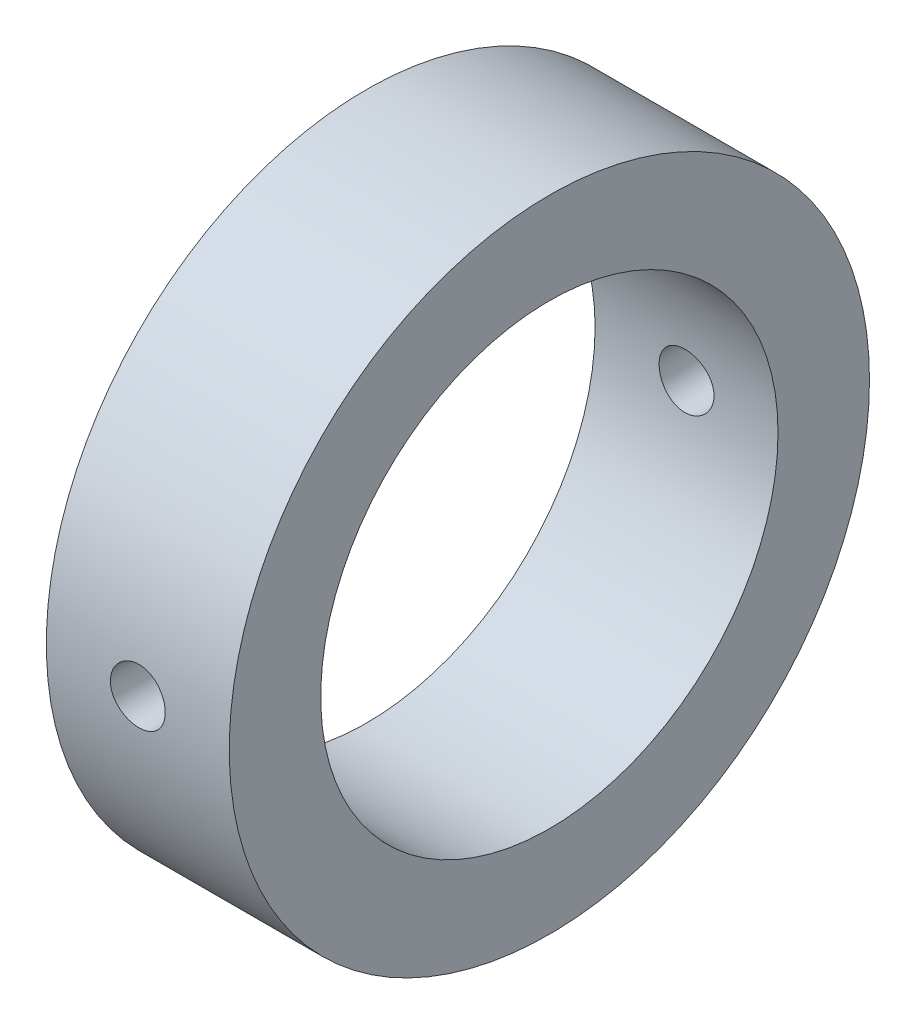
ISO-10303-21;
HEADER;
FILE_DESCRIPTION(('STEP AP214'),'2;1');
FILE_NAME('part.step','',(''),(''),'','','');
FILE_SCHEMA(('AUTOMOTIVE_DESIGN { 1 0 10303 214 1 1 1 1 }'));
ENDSEC;
DATA;
#1=APPLICATION_CONTEXT('core data for automotive mechanical design processes');
#2=APPLICATION_PROTOCOL_DEFINITION('international standard','automotive_design',2000,#1);
#3=PRODUCT_CONTEXT('',#1,'mechanical');
#4=PRODUCT('Part','Part','',(#3));
#5=PRODUCT_RELATED_PRODUCT_CATEGORY('part','',(#4));
#6=PRODUCT_DEFINITION_FORMATION('','',#4);
#7=PRODUCT_DEFINITION_CONTEXT('part definition',#1,'design');
#8=PRODUCT_DEFINITION('design','',#6,#7);
#9=PRODUCT_DEFINITION_SHAPE('','',#8);
#10=(LENGTH_UNIT() NAMED_UNIT(*) SI_UNIT(.MILLI.,.METRE.));
#11=(NAMED_UNIT(*) PLANE_ANGLE_UNIT() SI_UNIT($,.RADIAN.));
#12=(NAMED_UNIT(*) SI_UNIT($,.STERADIAN.) SOLID_ANGLE_UNIT());
#13=UNCERTAINTY_MEASURE_WITH_UNIT(LENGTH_MEASURE(1.E-05),#10,'distance_accuracy_value','');
#14=(GEOMETRIC_REPRESENTATION_CONTEXT(3) GLOBAL_UNCERTAINTY_ASSIGNED_CONTEXT((#13)) GLOBAL_UNIT_ASSIGNED_CONTEXT((#10,
#11,#12)) REPRESENTATION_CONTEXT('',''));
#15=CARTESIAN_POINT('',(0.,0.,0.));
#16=DIRECTION('',(0.,0.,1.));
#17=DIRECTION('',(1.,0.,0.));
#18=AXIS2_PLACEMENT_3D('',#15,#16,#17);
#19=CARTESIAN_POINT('',(20.,0.,0.));
#20=DIRECTION('',(1.,0.,0.));
#21=DIRECTION('',(0.,0.,-1.));
#22=AXIS2_PLACEMENT_3D('',#19,#20,#21);
#23=PLANE('',#22);
#24=CARTESIAN_POINT('',(20.,0.,0.));
#25=DIRECTION('',(1.,0.,0.));
#26=DIRECTION('',(0.,0.,-1.));
#27=AXIS2_PLACEMENT_3D('',#24,#25,#26);
#28=CIRCLE('',#27,35.);
#29=CARTESIAN_POINT('',(20.,0.,-35.));
#30=VERTEX_POINT('',#29);
#31=EDGE_CURVE('E10',#30,#30,#28,.T.);
#32=ORIENTED_EDGE('',*,*,#31,.T.);
#33=EDGE_LOOP('',(#32));
#34=FACE_BOUND('',#33,.T.);
#35=CARTESIAN_POINT('',(20.,0.,0.));
#36=DIRECTION('',(1.,0.,0.));
#37=DIRECTION('',(0.,0.,-1.));
#38=AXIS2_PLACEMENT_3D('',#35,#36,#37);
#39=CIRCLE('',#38,25.);
#40=CARTESIAN_POINT('',(20.,0.,-25.));
#41=VERTEX_POINT('',#40);
#42=EDGE_CURVE('E64',#41,#41,#39,.T.);
#43=ORIENTED_EDGE('',*,*,#42,.F.);
#44=EDGE_LOOP('',(#43));
#45=FACE_BOUND('',#44,.T.);
#46=ADVANCED_FACE('F43',(#34,#45),#23,.T.);
#47=CARTESIAN_POINT('',(0.,0.,0.));
#48=DIRECTION('',(1.,0.,0.));
#49=DIRECTION('',(0.,0.,-1.));
#50=AXIS2_PLACEMENT_3D('',#47,#48,#49);
#51=PLANE('',#50);
#52=CARTESIAN_POINT('',(0.,0.,0.));
#53=DIRECTION('',(1.,0.,0.));
#54=DIRECTION('',(0.,0.,-1.));
#55=AXIS2_PLACEMENT_3D('',#52,#53,#54);
#56=CIRCLE('',#55,35.);
#57=CARTESIAN_POINT('',(0.,0.,-35.));
#58=VERTEX_POINT('',#57);
#59=EDGE_CURVE('E58',#58,#58,#56,.T.);
#60=ORIENTED_EDGE('',*,*,#59,.F.);
#61=EDGE_LOOP('',(#60));
#62=FACE_BOUND('',#61,.T.);
#63=CARTESIAN_POINT('',(0.,0.,0.));
#64=DIRECTION('',(1.,0.,0.));
#65=DIRECTION('',(0.,0.,-1.));
#66=AXIS2_PLACEMENT_3D('',#63,#64,#65);
#67=CIRCLE('',#66,25.);
#68=CARTESIAN_POINT('',(0.,0.,-25.));
#69=VERTEX_POINT('',#68);
#70=EDGE_CURVE('E67',#69,#69,#67,.T.);
#71=ORIENTED_EDGE('',*,*,#70,.T.);
#72=EDGE_LOOP('',(#71));
#73=FACE_BOUND('',#72,.T.);
#74=ADVANCED_FACE('F108',(#62,#73),#51,.F.);
#75=CARTESIAN_POINT('',(20.,0.,0.));
#76=DIRECTION('',(-1.,0.,0.));
#77=DIRECTION('',(0.,0.,1.));
#78=AXIS2_PLACEMENT_3D('',#75,#76,#77);
#79=CYLINDRICAL_SURFACE('',#78,35.);
#80=CARTESIAN_POINT('',(13.,0.,-35.));
#81=CARTESIAN_POINT('',(12.9999926621086,0.168180177421425,-34.9999983189466));
#82=CARTESIAN_POINT('',(12.9858101377132,0.336474410694065,-34.9987748870089));
#83=CARTESIAN_POINT('',(12.9294427662291,0.668405276387218,-34.9940120055983));
#84=CARTESIAN_POINT('',(12.8872263096079,0.832036433522409,-34.9904699418268));
#85=CARTESIAN_POINT('',(12.7760219308489,1.14978580604665,-34.9814700099417));
#86=CARTESIAN_POINT('',(12.7070492915307,1.30390939390644,-34.9760132356579));
#87=CARTESIAN_POINT('',(12.5443180840418,1.5983553572425,-34.9637955952331));
#88=CARTESIAN_POINT('',(12.4505647683675,1.7386806487592,-34.9570350055299));
#89=CARTESIAN_POINT('',(12.2406617110507,2.00196024172095,-34.9429478698077));
#90=CARTESIAN_POINT('',(12.1244591132005,2.12487233650439,-34.9356200130702));
#91=CARTESIAN_POINT('',(11.8730679106441,2.34947428548936,-34.9212352148941));
#92=CARTESIAN_POINT('',(11.7378784666713,2.45116320107853,-34.9141782854488));
#93=CARTESIAN_POINT('',(11.4520942390574,2.63057608789142,-34.9011203668809));
#94=CARTESIAN_POINT('',(11.3014759820008,2.70826279885841,-34.895121025662));
#95=CARTESIAN_POINT('',(10.9892731041776,2.83722803822897,-34.8848727505605));
#96=CARTESIAN_POINT('',(10.8276886872931,2.88850705745045,-34.8806237841455));
#97=CARTESIAN_POINT('',(10.4985643557107,2.96307845769353,-34.8743684880487));
#98=CARTESIAN_POINT('',(10.3310401716124,2.98643979537529,-34.8723566335604));
#99=CARTESIAN_POINT('',(9.99443731566983,3.00472573441206,-34.8707859372111));
#100=CARTESIAN_POINT('',(9.82535867460139,2.99965089755265,-34.8712270468893));
#101=CARTESIAN_POINT('',(9.49091935009246,2.96126551313284,-34.874507414771));
#102=CARTESIAN_POINT('',(9.32554998866099,2.92802995365881,-34.8773403039272));
#103=CARTESIAN_POINT('',(9.00274549875546,2.83438308452453,-34.8850750500347));
#104=CARTESIAN_POINT('',(8.84531045172664,2.77397149596723,-34.8899769282191));
#105=CARTESIAN_POINT('',(8.5426048976093,2.62760362876988,-34.9013046627491));
#106=CARTESIAN_POINT('',(8.39735071245932,2.54161375570937,-34.9077325210554));
#107=CARTESIAN_POINT('',(8.12330862382476,2.34655446417304,-34.9213861292491));
#108=CARTESIAN_POINT('',(7.99452107351525,2.23748455081154,-34.9286118962437));
#109=CARTESIAN_POINT('',(7.75663207823613,1.99894091774494,-34.9430754969892));
#110=CARTESIAN_POINT('',(7.64759561833133,1.86940237855328,-34.9503132942366));
#111=CARTESIAN_POINT('',(7.45280656292255,1.59382461581758,-34.9639632077666));
#112=CARTESIAN_POINT('',(7.36705398418778,1.44778538038973,-34.9703753234546));
#113=CARTESIAN_POINT('',(7.2212707481009,1.14330913680171,-34.9816527329005));
#114=CARTESIAN_POINT('',(7.16124302414623,0.984870717201057,-34.9865178502383));
#115=CARTESIAN_POINT('',(7.06865924334512,0.660113221128349,-34.9941511080319));
#116=CARTESIAN_POINT('',(7.03610258328611,0.493794317781496,-34.9969192945321));
#117=CARTESIAN_POINT('',(6.99946669791016,0.158560250833971,-35.0000408811528));
#118=CARTESIAN_POINT('',(6.99529772286168,-0.0103450366761299,-35.0004018916599));
#119=CARTESIAN_POINT('',(7.01532035576532,-0.346452104482659,-34.9986887867208));
#120=CARTESIAN_POINT('',(7.03951168360929,-0.513653901587615,-34.9966146953254));
#121=CARTESIAN_POINT('',(7.11549382233641,-0.841351421558966,-34.9902695086844));
#122=CARTESIAN_POINT('',(7.16724297716301,-1.00185687270474,-34.9860017297263));
#123=CARTESIAN_POINT('',(7.29682922006561,-1.31190702245475,-34.9757485102754));
#124=CARTESIAN_POINT('',(7.37466674367936,-1.46145153801856,-34.9697630411066));
#125=CARTESIAN_POINT('',(7.55444535294469,-1.7457428816744,-34.9567262474856));
#126=CARTESIAN_POINT('',(7.65644583152676,-1.88045202960912,-34.9496723123826));
#127=CARTESIAN_POINT('',(7.88156921992449,-2.13086824169311,-34.9352996751561));
#128=CARTESIAN_POINT('',(8.00469251803617,-2.24657495644839,-34.9279809681673));
#129=CARTESIAN_POINT('',(8.26895626973909,-2.45601016602155,-34.9138810732733));
#130=CARTESIAN_POINT('',(8.41014326356234,-2.54968004901865,-34.9071013498897));
#131=CARTESIAN_POINT('',(8.70629524502194,-2.71198063229128,-34.8948680127784));
#132=CARTESIAN_POINT('',(8.8612600882557,-2.78061159495576,-34.8894143851545));
#133=CARTESIAN_POINT('',(9.18036221112401,-2.8907865424564,-34.8804590783594));
#134=CARTESIAN_POINT('',(9.34448707344406,-2.93236627395852,-34.8769548240937));
#135=CARTESIAN_POINT('',(9.67742005737787,-2.98737479633476,-34.872286503041));
#136=CARTESIAN_POINT('',(9.84622808317732,-3.0008041627162,-34.871122388412));
#137=CARTESIAN_POINT('',(10.1831530647903,-2.99912392353084,-34.8712668950776));
#138=CARTESIAN_POINT('',(10.3512704909289,-2.98410640669543,-34.8725675374249));
#139=CARTESIAN_POINT('',(10.6825859274482,-2.92615085557176,-34.8774780477604));
#140=CARTESIAN_POINT('',(10.8457839305537,-2.88321277999482,-34.8810879191635));
#141=CARTESIAN_POINT('',(11.1626330215739,-2.7706585792072,-34.8902080316544));
#142=CARTESIAN_POINT('',(11.3162847539864,-2.70104425727074,-34.8957181442861));
#143=CARTESIAN_POINT('',(11.6097355757974,-2.53712384137618,-34.9080181097009));
#144=CARTESIAN_POINT('',(11.7495348640265,-2.4428181018962,-34.9148079441114));
#145=CARTESIAN_POINT('',(12.0117838459397,-2.23184571903132,-34.9289284828144));
#146=CARTESIAN_POINT('',(12.1341785330169,-2.11511080731054,-34.9362607952504));
#147=CARTESIAN_POINT('',(12.357688026767,-1.86271960746937,-34.9506254222313));
#148=CARTESIAN_POINT('',(12.4587976843829,-1.72705875414518,-34.9576576638589));
#149=CARTESIAN_POINT('',(12.6370108284413,-1.44039065385252,-34.9706432183249));
#150=CARTESIAN_POINT('',(12.7140672103455,-1.28935405311577,-34.9765944046818));
#151=CARTESIAN_POINT('',(12.8416267776672,-0.976537475486436,-34.9867226680456));
#152=CARTESIAN_POINT('',(12.8921604088507,-0.814770058056751,-34.9909017781752));
#153=CARTESIAN_POINT('',(12.9524054943071,-0.543377751492647,-34.9959451685553));
#154=CARTESIAN_POINT('',(12.9702296244532,-0.4354969109927,-34.9974587860022));
#155=CARTESIAN_POINT('',(12.9940292435666,-0.218426750644092,-34.9994867462511));
#156=CARTESIAN_POINT('',(13.0000047661528,-0.109237434508938,-35.0000010918883));
#157=CARTESIAN_POINT('',(13.,0.,-35.));
#158=B_SPLINE_CURVE_WITH_KNOTS('',3,(#80,#81,#82,#83,#84,#85,#86,#87,#88,#89,#90,#91,#92,#93,
#94,#95,#96,#97,#98,#99,#100,#101,#102,#103,#104,#105,#106,#107,#108,#109,#110,#111,#112,#113,
#114,#115,#116,#117,#118,#119,#120,#121,#122,#123,#124,#125,#126,#127,#128,#129,#130,#131,#132,
#133,#134,#135,#136,#137,#138,#139,#140,#141,#142,#143,#144,#145,#146,#147,#148,#149,#150,#151,
#152,#153,#154,#155,#156,#157),.UNSPECIFIED.,.T.,.F.,(4,2,2,2,2,2,2,2,2,2,2,2,2,2,2,2,2,2,2,2,2,
2,2,2,2,2,2,2,2,2,2,2,2,2,2,2,2,2,4),(0.,0.504141688620748,1.0088527873041,1.51327602436422,
2.01759242981481,2.5231110330061,3.0286519884333,3.53497383147415,4.04128626359052,
4.54634550220951,5.05139476290399,5.55510335902216,6.05881712462464,6.56319540924795,
7.06758450992202,7.57360414720597,8.07962414892789,8.58570183661506,9.09176841150507,
9.59623427417642,10.1006951543972,10.6043956535469,11.1081045622491,11.6130646830275,
12.1180340873686,12.6243317573245,13.1306241215114,13.636246082805,14.1418577070399,
14.6458353534655,15.1498137451707,15.6537580747011,16.1576951698375,16.6631911333163,
17.1688092410494,17.6754113983993,18.1814307424438,18.5088849156758,18.8363381597995),.UNSPECIFIED.);
#159=CARTESIAN_POINT('',(13.,0.,-35.));
#160=VERTEX_POINT('',#159);
#161=EDGE_CURVE('E94',#160,#160,#158,.T.);
#162=ORIENTED_EDGE('',*,*,#161,.T.);
#163=EDGE_LOOP('',(#162));
#164=FACE_BOUND('',#163,.T.);
#165=CARTESIAN_POINT('',(13.,0.,35.));
#166=CARTESIAN_POINT('',(12.9999926621086,-0.168180177421425,34.9999983189466));
#167=CARTESIAN_POINT('',(12.9858101377132,-0.336474410694065,34.9987748870089));
#168=CARTESIAN_POINT('',(12.9294427662291,-0.668405276387218,34.9940120055983));
#169=CARTESIAN_POINT('',(12.8872263096079,-0.832036433522409,34.9904699418268));
#170=CARTESIAN_POINT('',(12.7760219308489,-1.14978580604665,34.9814700099417));
#171=CARTESIAN_POINT('',(12.7070492915307,-1.30390939390644,34.9760132356579));
#172=CARTESIAN_POINT('',(12.5443180840418,-1.5983553572425,34.9637955952331));
#173=CARTESIAN_POINT('',(12.4505647683675,-1.7386806487592,34.9570350055299));
#174=CARTESIAN_POINT('',(12.2406617110507,-2.00196024172095,34.9429478698077));
#175=CARTESIAN_POINT('',(12.1244591132005,-2.12487233650439,34.9356200130702));
#176=CARTESIAN_POINT('',(11.8730679106441,-2.34947428548936,34.9212352148941));
#177=CARTESIAN_POINT('',(11.7378784666713,-2.45116320107853,34.9141782854488));
#178=CARTESIAN_POINT('',(11.4520942390574,-2.63057608789142,34.9011203668809));
#179=CARTESIAN_POINT('',(11.3014759820008,-2.70826279885841,34.895121025662));
#180=CARTESIAN_POINT('',(10.9892731041776,-2.83722803822897,34.8848727505605));
#181=CARTESIAN_POINT('',(10.8276886872931,-2.88850705745045,34.8806237841455));
#182=CARTESIAN_POINT('',(10.4985643557107,-2.96307845769353,34.8743684880487));
#183=CARTESIAN_POINT('',(10.3310401716124,-2.98643979537529,34.8723566335604));
#184=CARTESIAN_POINT('',(9.99443731566983,-3.00472573441206,34.8707859372111));
#185=CARTESIAN_POINT('',(9.82535867460139,-2.99965089755265,34.8712270468893));
#186=CARTESIAN_POINT('',(9.49091935009246,-2.96126551313284,34.874507414771));
#187=CARTESIAN_POINT('',(9.32554998866099,-2.92802995365881,34.8773403039272));
#188=CARTESIAN_POINT('',(9.00274549875546,-2.83438308452453,34.8850750500347));
#189=CARTESIAN_POINT('',(8.84531045172664,-2.77397149596723,34.8899769282191));
#190=CARTESIAN_POINT('',(8.5426048976093,-2.62760362876988,34.9013046627491));
#191=CARTESIAN_POINT('',(8.39735071245932,-2.54161375570937,34.9077325210554));
#192=CARTESIAN_POINT('',(8.12330862382476,-2.34655446417304,34.9213861292491));
#193=CARTESIAN_POINT('',(7.99452107351525,-2.23748455081154,34.9286118962437));
#194=CARTESIAN_POINT('',(7.75663207823613,-1.99894091774494,34.9430754969892));
#195=CARTESIAN_POINT('',(7.64759561833133,-1.86940237855328,34.9503132942366));
#196=CARTESIAN_POINT('',(7.45280656292255,-1.59382461581758,34.9639632077666));
#197=CARTESIAN_POINT('',(7.36705398418778,-1.44778538038973,34.9703753234546));
#198=CARTESIAN_POINT('',(7.2212707481009,-1.14330913680171,34.9816527329005));
#199=CARTESIAN_POINT('',(7.16124302414623,-0.984870717201057,34.9865178502383));
#200=CARTESIAN_POINT('',(7.06865924334512,-0.660113221128349,34.9941511080319));
#201=CARTESIAN_POINT('',(7.03610258328611,-0.493794317781496,34.9969192945321));
#202=CARTESIAN_POINT('',(6.99946669791016,-0.158560250833971,35.0000408811528));
#203=CARTESIAN_POINT('',(6.99529772286168,0.0103450366761299,35.0004018916599));
#204=CARTESIAN_POINT('',(7.01532035576532,0.346452104482659,34.9986887867208));
#205=CARTESIAN_POINT('',(7.03951168360929,0.513653901587615,34.9966146953254));
#206=CARTESIAN_POINT('',(7.11549382233641,0.841351421558966,34.9902695086844));
#207=CARTESIAN_POINT('',(7.16724297716301,1.00185687270474,34.9860017297263));
#208=CARTESIAN_POINT('',(7.29682922006561,1.31190702245475,34.9757485102754));
#209=CARTESIAN_POINT('',(7.37466674367936,1.46145153801856,34.9697630411066));
#210=CARTESIAN_POINT('',(7.55444535294469,1.7457428816744,34.9567262474856));
#211=CARTESIAN_POINT('',(7.65644583152676,1.88045202960912,34.9496723123826));
#212=CARTESIAN_POINT('',(7.88156921992449,2.13086824169311,34.9352996751561));
#213=CARTESIAN_POINT('',(8.00469251803617,2.24657495644839,34.9279809681673));
#214=CARTESIAN_POINT('',(8.26895626973909,2.45601016602155,34.9138810732733));
#215=CARTESIAN_POINT('',(8.41014326356234,2.54968004901865,34.9071013498897));
#216=CARTESIAN_POINT('',(8.70629524502194,2.71198063229128,34.8948680127784));
#217=CARTESIAN_POINT('',(8.8612600882557,2.78061159495576,34.8894143851545));
#218=CARTESIAN_POINT('',(9.18036221112401,2.8907865424564,34.8804590783594));
#219=CARTESIAN_POINT('',(9.34448707344406,2.93236627395852,34.8769548240937));
#220=CARTESIAN_POINT('',(9.67742005737787,2.98737479633476,34.872286503041));
#221=CARTESIAN_POINT('',(9.84622808317732,3.0008041627162,34.871122388412));
#222=CARTESIAN_POINT('',(10.1831530647903,2.99912392353084,34.8712668950776));
#223=CARTESIAN_POINT('',(10.3512704909289,2.98410640669543,34.8725675374249));
#224=CARTESIAN_POINT('',(10.6825859274482,2.92615085557176,34.8774780477604));
#225=CARTESIAN_POINT('',(10.8457839305537,2.88321277999482,34.8810879191635));
#226=CARTESIAN_POINT('',(11.1626330215739,2.7706585792072,34.8902080316544));
#227=CARTESIAN_POINT('',(11.3162847539864,2.70104425727074,34.8957181442861));
#228=CARTESIAN_POINT('',(11.6097355757974,2.53712384137618,34.9080181097009));
#229=CARTESIAN_POINT('',(11.7495348640265,2.4428181018962,34.9148079441114));
#230=CARTESIAN_POINT('',(12.0117838459397,2.23184571903132,34.9289284828144));
#231=CARTESIAN_POINT('',(12.1341785330169,2.11511080731054,34.9362607952504));
#232=CARTESIAN_POINT('',(12.357688026767,1.86271960746937,34.9506254222313));
#233=CARTESIAN_POINT('',(12.4587976843829,1.72705875414518,34.9576576638589));
#234=CARTESIAN_POINT('',(12.6370108284413,1.44039065385252,34.9706432183249));
#235=CARTESIAN_POINT('',(12.7140672103455,1.28935405311577,34.9765944046818));
#236=CARTESIAN_POINT('',(12.8416267776672,0.976537475486436,34.9867226680456));
#237=CARTESIAN_POINT('',(12.8921604088507,0.814770058056751,34.9909017781752));
#238=CARTESIAN_POINT('',(12.9524054943071,0.543377751492647,34.9959451685553));
#239=CARTESIAN_POINT('',(12.9702296244532,0.4354969109927,34.9974587860022));
#240=CARTESIAN_POINT('',(12.9940292435666,0.218426750644092,34.9994867462511));
#241=CARTESIAN_POINT('',(13.0000047661528,0.109237434508938,35.0000010918883));
#242=CARTESIAN_POINT('',(13.,0.,35.));
#243=B_SPLINE_CURVE_WITH_KNOTS('',3,(#165,#166,#167,#168,#169,#170,#171,#172,#173,#174,#175,
#176,#177,#178,#179,#180,#181,#182,#183,#184,#185,#186,#187,#188,#189,#190,#191,#192,#193,#194,
#195,#196,#197,#198,#199,#200,#201,#202,#203,#204,#205,#206,#207,#208,#209,#210,#211,#212,#213,
#214,#215,#216,#217,#218,#219,#220,#221,#222,#223,#224,#225,#226,#227,#228,#229,#230,#231,#232,
#233,#234,#235,#236,#237,#238,#239,#240,#241,#242),.UNSPECIFIED.,.T.,.F.,(4,2,2,2,2,2,2,2,2,2,2,
2,2,2,2,2,2,2,2,2,2,2,2,2,2,2,2,2,2,2,2,2,2,2,2,2,2,2,4),(0.,0.504141688620748,1.0088527873041,
1.51327602436422,2.01759242981481,2.5231110330061,3.0286519884333,3.53497383147415,
4.04128626359052,4.54634550220951,5.05139476290399,5.55510335902216,6.05881712462464,
6.56319540924795,7.06758450992202,7.57360414720597,8.07962414892789,8.58570183661506,
9.09176841150507,9.59623427417642,10.1006951543972,10.6043956535469,11.1081045622491,
11.6130646830275,12.1180340873686,12.6243317573245,13.1306241215114,13.636246082805,
14.1418577070399,14.6458353534655,15.1498137451707,15.6537580747011,16.1576951698375,
16.6631911333163,17.1688092410494,17.6754113983993,18.1814307424438,18.5088849156758,
18.8363381597995),.UNSPECIFIED.);
#244=CARTESIAN_POINT('',(13.,0.,35.));
#245=VERTEX_POINT('',#244);
#246=EDGE_CURVE('E88',#245,#245,#243,.T.);
#247=ORIENTED_EDGE('',*,*,#246,.T.);
#248=EDGE_LOOP('',(#247));
#249=FACE_BOUND('',#248,.T.);
#250=ORIENTED_EDGE('',*,*,#31,.F.);
#251=EDGE_LOOP('',(#250));
#252=FACE_BOUND('',#251,.T.);
#253=ORIENTED_EDGE('',*,*,#59,.T.);
#254=EDGE_LOOP('',(#253));
#255=FACE_BOUND('',#254,.T.);
#256=ADVANCED_FACE('F45',(#164,#249,#252,#255),#79,.T.);
#257=CARTESIAN_POINT('',(20.,0.,0.));
#258=DIRECTION('',(-1.,0.,0.));
#259=DIRECTION('',(0.,0.,1.));
#260=AXIS2_PLACEMENT_3D('',#257,#258,#259);
#261=CYLINDRICAL_SURFACE('',#260,25.);
#262=CARTESIAN_POINT('',(13.,0.,25.));
#263=CARTESIAN_POINT('',(12.9999928360586,-0.167864047107699,24.9999977357459));
#264=CARTESIAN_POINT('',(12.9858633413073,-0.335834317331191,24.9982914200408));
#265=CARTESIAN_POINT('',(12.9297189358446,-0.66710457130825,24.991648705422));
#266=CARTESIAN_POINT('',(12.8876745587494,-0.830399429590069,24.9867088933728));
#267=CARTESIAN_POINT('',(12.776953723474,-1.14747479534053,24.9741559265426));
#268=CARTESIAN_POINT('',(12.7082947931758,-1.30126148759225,24.9665445315309));
#269=CARTESIAN_POINT('',(12.5463312649167,-1.595099157832,24.9494959264345));
#270=CARTESIAN_POINT('',(12.4530310402467,-1.73515256713516,24.9400590404141));
#271=CARTESIAN_POINT('',(12.2439251380248,-1.99829131534451,24.920360105442));
#272=CARTESIAN_POINT('',(12.1280191598881,-2.1212966913072,24.9100945030904));
#273=CARTESIAN_POINT('',(11.8772070351121,-2.34615931038342,24.8899239397152));
#274=CARTESIAN_POINT('',(11.7422999409814,-2.44801549826474,24.8800189967068));
#275=CARTESIAN_POINT('',(11.4567991747016,-2.62798342873896,24.8616560370405));
#276=CARTESIAN_POINT('',(11.3061582754199,-2.7060207567257,24.8532025903971));
#277=CARTESIAN_POINT('',(10.9937912978913,-2.8356605730156,24.8387461344686));
#278=CARTESIAN_POINT('',(10.8320656080307,-2.88726398696776,24.8327430393798));
#279=CARTESIAN_POINT('',(10.5029471406886,-2.96232930045399,24.8239006073737));
#280=CARTESIAN_POINT('',(10.3355854715723,-2.98592577987646,24.8210461452543));
#281=CARTESIAN_POINT('',(9.99925506363583,-3.0047237521967,24.8187777690611));
#282=CARTESIAN_POINT('',(9.83028638478303,-2.99992630052848,24.8193637271033));
#283=CARTESIAN_POINT('',(9.49647403521565,-2.96218316078668,24.8238961466306));
#284=CARTESIAN_POINT('',(9.33161336131982,-2.92938543222303,24.8278249434675));
#285=CARTESIAN_POINT('',(9.00975297217864,-2.83680346170067,24.8385728087608));
#286=CARTESIAN_POINT('',(8.85275340482101,-2.77701871225814,24.8453919315688));
#287=CARTESIAN_POINT('',(8.55061053176089,-2.63199980699862,24.8611722079476));
#288=CARTESIAN_POINT('',(8.40549852164644,-2.54670106203925,24.8701387862198));
#289=CARTESIAN_POINT('',(8.13159278908424,-2.35312173169469,24.8891993987901));
#290=CARTESIAN_POINT('',(8.00279975509743,-2.24484017723156,24.8992934806213));
#291=CARTESIAN_POINT('',(7.76432891563562,-2.0075475556218,24.9195503308637));
#292=CARTESIAN_POINT('',(7.65477803014294,-1.87840890051216,24.929713127424));
#293=CARTESIAN_POINT('',(7.45888847899969,-1.60350795893872,24.9489020798549));
#294=CARTESIAN_POINT('',(7.37254985998085,-1.45774563908005,24.9579282334421));
#295=CARTESIAN_POINT('',(7.22553671436034,-1.15363930826285,24.9738318861702));
#296=CARTESIAN_POINT('',(7.16486980666956,-0.995291578715591,24.9807087472809));
#297=CARTESIAN_POINT('',(7.0710212621491,-0.670556022273439,24.991533065309));
#298=CARTESIAN_POINT('',(7.03783843999552,-0.504168542441623,24.9954806485584));
#299=CARTESIAN_POINT('',(7.00006374450231,-0.169174396374216,24.9999852500304));
#300=CARTESIAN_POINT('',(6.9952969675993,-0.000587720432051065,25.0005630093753));
#301=CARTESIAN_POINT('',(7.01402857786827,0.334982068243261,24.9983187823231));
#302=CARTESIAN_POINT('',(7.03752641129535,0.501965212327329,24.9954968625308));
#303=CARTESIAN_POINT('',(7.11197496400309,0.829074263928357,24.9867833380686));
#304=CARTESIAN_POINT('',(7.16284261305008,0.989219346369035,24.9809010237909));
#305=CARTESIAN_POINT('',(7.29050070335358,1.29870539768646,24.9667255501792));
#306=CARTESIAN_POINT('',(7.36729196149009,1.44804602592347,24.9584323148759));
#307=CARTESIAN_POINT('',(7.54504291590243,1.73246717766504,24.9403085158695));
#308=CARTESIAN_POINT('',(7.64611613781082,1.86747628962751,24.9304708084643));
#309=CARTESIAN_POINT('',(7.86940084640817,2.11867625152203,24.9103817919419));
#310=CARTESIAN_POINT('',(7.99161310414795,2.23486641472949,24.9001304677484));
#311=CARTESIAN_POINT('',(8.25447561542769,2.44574795226154,24.8803059484942));
#312=CARTESIAN_POINT('',(8.39521901534385,2.54032363231939,24.8707365831307));
#313=CARTESIAN_POINT('',(8.69069502507556,2.70449314429332,24.8534214993383));
#314=CARTESIAN_POINT('',(8.84542737311824,2.77408744356074,24.8456757467943));
#315=CARTESIAN_POINT('',(9.1641106088947,2.88612996668159,24.8329105734502));
#316=CARTESIAN_POINT('',(9.32803801185939,2.92864420159346,24.8278845275633));
#317=CARTESIAN_POINT('',(9.66076896948507,2.98553272163516,24.8211085274587));
#318=CARTESIAN_POINT('',(9.82957231615733,2.99990820526081,24.8193584337106));
#319=CARTESIAN_POINT('',(10.1661127296372,3.00009033817931,24.819336326607));
#320=CARTESIAN_POINT('',(10.3338497257713,2.98607873671351,24.8210421863943));
#321=CARTESIAN_POINT('',(10.6645667863942,2.93026848672089,24.8276922947425));
#322=CARTESIAN_POINT('',(10.8275468491756,2.88846982822067,24.8326365444656));
#323=CARTESIAN_POINT('',(11.1441045388887,2.77832739820545,24.8451996524586));
#324=CARTESIAN_POINT('',(11.2976849934955,2.70999165570539,24.8528177016812));
#325=CARTESIAN_POINT('',(11.5912277470701,2.5487328262801,24.8698714539139));
#326=CARTESIAN_POINT('',(11.7311899284593,2.45580952709445,24.8793071726153));
#327=CARTESIAN_POINT('',(11.9944529401088,2.24733689647205,24.8990055122588));
#328=CARTESIAN_POINT('',(12.1176461032663,2.1316520393015,24.9092728581347));
#329=CARTESIAN_POINT('',(12.342942479566,1.88122093334447,24.9294354968169));
#330=CARTESIAN_POINT('',(12.4450406976292,1.74647018263601,24.939330701051));
#331=CARTESIAN_POINT('',(12.6255505779989,1.46119322465137,24.9576721709324));
#332=CARTESIAN_POINT('',(12.7038777257223,1.31061323462417,24.966113221621));
#333=CARTESIAN_POINT('',(12.8340237644426,0.99842275168531,24.9805418519727));
#334=CARTESIAN_POINT('',(12.8858716961804,0.836824564362143,24.9865321180615));
#335=CARTESIAN_POINT('',(12.9490634203381,0.561977101236695,24.9939268325999));
#336=CARTESIAN_POINT('',(12.9681374838864,0.450466569753485,24.996193279433));
#337=CARTESIAN_POINT('',(12.993608143491,0.225986735693693,24.9992306204204));
#338=CARTESIAN_POINT('',(13.0000048232505,0.113017442753625,25.0000015244492));
#339=CARTESIAN_POINT('',(13.,0.,25.));
#340=B_SPLINE_CURVE_WITH_KNOTS('',3,(#262,#263,#264,#265,#266,#267,#268,#269,#270,#271,#272,
#273,#274,#275,#276,#277,#278,#279,#280,#281,#282,#283,#284,#285,#286,#287,#288,#289,#290,#291,
#292,#293,#294,#295,#296,#297,#298,#299,#300,#301,#302,#303,#304,#305,#306,#307,#308,#309,#310,
#311,#312,#313,#314,#315,#316,#317,#318,#319,#320,#321,#322,#323,#324,#325,#326,#327,#328,#329,
#330,#331,#332,#333,#334,#335,#336,#337,#338,#339),.UNSPECIFIED.,.T.,.F.,(4,2,2,2,2,2,2,2,2,2,2,
2,2,2,2,2,2,2,2,2,2,2,2,2,2,2,2,2,2,2,2,2,2,2,2,2,2,2,4),(0.,0.503179350956159,1.00689069408623,
1.5102708637556,2.01356175441693,2.51913872195878,3.02474090904883,3.53190689496397,
4.03905511999114,4.54375638343279,5.0484388866848,5.55047092912253,6.05251241253396,
6.55583573710536,7.05918028869262,7.56572944640317,8.07227962172601,8.57898002694278,
9.08565857822619,9.58921522624226,10.0927620090108,10.5947890255775,11.0968318630167,
11.6012692178556,12.1057249760356,12.6128207581672,13.119907053063,13.6257524826489,
14.1315763666154,14.6341719319229,15.1367676776234,15.6392114771388,16.1416596143122,
16.6471952402032,17.1528504352009,17.6602829023946,18.1671576479275,18.5059342945627,
18.8447087043981),.UNSPECIFIED.);
#341=CARTESIAN_POINT('',(13.,0.,25.));
#342=VERTEX_POINT('',#341);
#343=EDGE_CURVE('E48',#342,#342,#340,.T.);
#344=ORIENTED_EDGE('',*,*,#343,.F.);
#345=EDGE_LOOP('',(#344));
#346=FACE_BOUND('',#345,.T.);
#347=CARTESIAN_POINT('',(13.,0.,-25.));
#348=CARTESIAN_POINT('',(12.9999928360586,0.167864047107699,-24.9999977357459));
#349=CARTESIAN_POINT('',(12.9858633413073,0.335834317331191,-24.9982914200408));
#350=CARTESIAN_POINT('',(12.9297189358446,0.66710457130825,-24.991648705422));
#351=CARTESIAN_POINT('',(12.8876745587494,0.830399429590069,-24.9867088933728));
#352=CARTESIAN_POINT('',(12.776953723474,1.14747479534053,-24.9741559265426));
#353=CARTESIAN_POINT('',(12.7082947931758,1.30126148759225,-24.9665445315309));
#354=CARTESIAN_POINT('',(12.5463312649167,1.595099157832,-24.9494959264345));
#355=CARTESIAN_POINT('',(12.4530310402467,1.73515256713516,-24.9400590404141));
#356=CARTESIAN_POINT('',(12.2439251380248,1.99829131534451,-24.920360105442));
#357=CARTESIAN_POINT('',(12.1280191598881,2.1212966913072,-24.9100945030904));
#358=CARTESIAN_POINT('',(11.8772070351121,2.34615931038342,-24.8899239397152));
#359=CARTESIAN_POINT('',(11.7422999409814,2.44801549826474,-24.8800189967068));
#360=CARTESIAN_POINT('',(11.4567991747016,2.62798342873896,-24.8616560370405));
#361=CARTESIAN_POINT('',(11.3061582754199,2.7060207567257,-24.8532025903971));
#362=CARTESIAN_POINT('',(10.9937912978913,2.8356605730156,-24.8387461344686));
#363=CARTESIAN_POINT('',(10.8320656080307,2.88726398696776,-24.8327430393798));
#364=CARTESIAN_POINT('',(10.5029471406886,2.96232930045399,-24.8239006073737));
#365=CARTESIAN_POINT('',(10.3355854715723,2.98592577987646,-24.8210461452543));
#366=CARTESIAN_POINT('',(9.99925506363583,3.0047237521967,-24.8187777690611));
#367=CARTESIAN_POINT('',(9.83028638478303,2.99992630052848,-24.8193637271033));
#368=CARTESIAN_POINT('',(9.49647403521565,2.96218316078668,-24.8238961466306));
#369=CARTESIAN_POINT('',(9.33161336131982,2.92938543222303,-24.8278249434675));
#370=CARTESIAN_POINT('',(9.00975297217864,2.83680346170067,-24.8385728087608));
#371=CARTESIAN_POINT('',(8.85275340482101,2.77701871225814,-24.8453919315688));
#372=CARTESIAN_POINT('',(8.55061053176089,2.63199980699862,-24.8611722079476));
#373=CARTESIAN_POINT('',(8.40549852164644,2.54670106203925,-24.8701387862198));
#374=CARTESIAN_POINT('',(8.13159278908424,2.35312173169469,-24.8891993987901));
#375=CARTESIAN_POINT('',(8.00279975509743,2.24484017723156,-24.8992934806213));
#376=CARTESIAN_POINT('',(7.76432891563562,2.0075475556218,-24.9195503308637));
#377=CARTESIAN_POINT('',(7.65477803014294,1.87840890051216,-24.929713127424));
#378=CARTESIAN_POINT('',(7.45888847899969,1.60350795893872,-24.9489020798549));
#379=CARTESIAN_POINT('',(7.37254985998085,1.45774563908005,-24.9579282334421));
#380=CARTESIAN_POINT('',(7.22553671436034,1.15363930826285,-24.9738318861702));
#381=CARTESIAN_POINT('',(7.16486980666956,0.995291578715591,-24.9807087472809));
#382=CARTESIAN_POINT('',(7.0710212621491,0.670556022273439,-24.991533065309));
#383=CARTESIAN_POINT('',(7.03783843999552,0.504168542441623,-24.9954806485584));
#384=CARTESIAN_POINT('',(7.00006374450231,0.169174396374216,-24.9999852500304));
#385=CARTESIAN_POINT('',(6.9952969675993,0.000587720432051065,-25.0005630093753));
#386=CARTESIAN_POINT('',(7.01402857786827,-0.334982068243261,-24.9983187823231));
#387=CARTESIAN_POINT('',(7.03752641129535,-0.501965212327329,-24.9954968625308));
#388=CARTESIAN_POINT('',(7.11197496400309,-0.829074263928357,-24.9867833380686));
#389=CARTESIAN_POINT('',(7.16284261305008,-0.989219346369035,-24.9809010237909));
#390=CARTESIAN_POINT('',(7.29050070335358,-1.29870539768646,-24.9667255501792));
#391=CARTESIAN_POINT('',(7.36729196149009,-1.44804602592347,-24.9584323148759));
#392=CARTESIAN_POINT('',(7.54504291590243,-1.73246717766504,-24.9403085158695));
#393=CARTESIAN_POINT('',(7.64611613781082,-1.86747628962751,-24.9304708084643));
#394=CARTESIAN_POINT('',(7.86940084640817,-2.11867625152203,-24.9103817919419));
#395=CARTESIAN_POINT('',(7.99161310414795,-2.23486641472949,-24.9001304677484));
#396=CARTESIAN_POINT('',(8.25447561542769,-2.44574795226154,-24.8803059484942));
#397=CARTESIAN_POINT('',(8.39521901534385,-2.54032363231939,-24.8707365831307));
#398=CARTESIAN_POINT('',(8.69069502507556,-2.70449314429332,-24.8534214993383));
#399=CARTESIAN_POINT('',(8.84542737311824,-2.77408744356074,-24.8456757467943));
#400=CARTESIAN_POINT('',(9.1641106088947,-2.88612996668159,-24.8329105734502));
#401=CARTESIAN_POINT('',(9.32803801185939,-2.92864420159346,-24.8278845275633));
#402=CARTESIAN_POINT('',(9.66076896948507,-2.98553272163516,-24.8211085274587));
#403=CARTESIAN_POINT('',(9.82957231615733,-2.99990820526081,-24.8193584337106));
#404=CARTESIAN_POINT('',(10.1661127296372,-3.00009033817931,-24.819336326607));
#405=CARTESIAN_POINT('',(10.3338497257713,-2.98607873671351,-24.8210421863943));
#406=CARTESIAN_POINT('',(10.6645667863942,-2.93026848672089,-24.8276922947425));
#407=CARTESIAN_POINT('',(10.8275468491756,-2.88846982822067,-24.8326365444656));
#408=CARTESIAN_POINT('',(11.1441045388887,-2.77832739820545,-24.8451996524586));
#409=CARTESIAN_POINT('',(11.2976849934955,-2.70999165570539,-24.8528177016812));
#410=CARTESIAN_POINT('',(11.5912277470701,-2.5487328262801,-24.8698714539139));
#411=CARTESIAN_POINT('',(11.7311899284593,-2.45580952709445,-24.8793071726153));
#412=CARTESIAN_POINT('',(11.9944529401088,-2.24733689647205,-24.8990055122588));
#413=CARTESIAN_POINT('',(12.1176461032663,-2.1316520393015,-24.9092728581347));
#414=CARTESIAN_POINT('',(12.342942479566,-1.88122093334447,-24.9294354968169));
#415=CARTESIAN_POINT('',(12.4450406976292,-1.74647018263601,-24.939330701051));
#416=CARTESIAN_POINT('',(12.6255505779989,-1.46119322465137,-24.9576721709324));
#417=CARTESIAN_POINT('',(12.7038777257223,-1.31061323462417,-24.966113221621));
#418=CARTESIAN_POINT('',(12.8340237644426,-0.99842275168531,-24.9805418519727));
#419=CARTESIAN_POINT('',(12.8858716961804,-0.836824564362143,-24.9865321180615));
#420=CARTESIAN_POINT('',(12.9490634203381,-0.561977101236695,-24.9939268325999));
#421=CARTESIAN_POINT('',(12.9681374838864,-0.450466569753485,-24.996193279433));
#422=CARTESIAN_POINT('',(12.993608143491,-0.225986735693693,-24.9992306204204));
#423=CARTESIAN_POINT('',(13.0000048232505,-0.113017442753625,-25.0000015244492));
#424=CARTESIAN_POINT('',(13.,0.,-25.));
#425=B_SPLINE_CURVE_WITH_KNOTS('',3,(#347,#348,#349,#350,#351,#352,#353,#354,#355,#356,#357,
#358,#359,#360,#361,#362,#363,#364,#365,#366,#367,#368,#369,#370,#371,#372,#373,#374,#375,#376,
#377,#378,#379,#380,#381,#382,#383,#384,#385,#386,#387,#388,#389,#390,#391,#392,#393,#394,#395,
#396,#397,#398,#399,#400,#401,#402,#403,#404,#405,#406,#407,#408,#409,#410,#411,#412,#413,#414,
#415,#416,#417,#418,#419,#420,#421,#422,#423,#424),.UNSPECIFIED.,.T.,.F.,(4,2,2,2,2,2,2,2,2,2,2,
2,2,2,2,2,2,2,2,2,2,2,2,2,2,2,2,2,2,2,2,2,2,2,2,2,2,2,4),(0.,0.503179350956159,1.00689069408623,
1.5102708637556,2.01356175441693,2.51913872195878,3.02474090904883,3.53190689496397,
4.03905511999114,4.54375638343279,5.0484388866848,5.55047092912253,6.05251241253396,
6.55583573710536,7.05918028869262,7.56572944640317,8.07227962172601,8.57898002694278,
9.08565857822619,9.58921522624226,10.0927620090108,10.5947890255775,11.0968318630167,
11.6012692178556,12.1057249760356,12.6128207581672,13.119907053063,13.6257524826489,
14.1315763666154,14.6341719319229,15.1367676776234,15.6392114771388,16.1416596143122,
16.6471952402032,17.1528504352009,17.6602829023946,18.1671576479275,18.5059342945627,
18.8447087043981),.UNSPECIFIED.);
#426=CARTESIAN_POINT('',(13.,0.,-25.));
#427=VERTEX_POINT('',#426);
#428=EDGE_CURVE('E69',#427,#427,#425,.T.);
#429=ORIENTED_EDGE('',*,*,#428,.F.);
#430=EDGE_LOOP('',(#429));
#431=FACE_BOUND('',#430,.T.);
#432=ORIENTED_EDGE('',*,*,#42,.T.);
#433=EDGE_LOOP('',(#432));
#434=FACE_BOUND('',#433,.T.);
#435=ORIENTED_EDGE('',*,*,#70,.F.);
#436=EDGE_LOOP('',(#435));
#437=FACE_BOUND('',#436,.T.);
#438=ADVANCED_FACE('F75',(#346,#431,#434,#437),#261,.F.);
#439=CARTESIAN_POINT('',(10.,0.,-35.));
#440=DIRECTION('',(0.,0.,1.));
#441=DIRECTION('',(1.,0.,0.));
#442=AXIS2_PLACEMENT_3D('',#439,#440,#441);
#443=CYLINDRICAL_SURFACE('',#442,3.);
#444=ORIENTED_EDGE('',*,*,#428,.T.);
#445=EDGE_LOOP('',(#444));
#446=FACE_BOUND('',#445,.T.);
#447=ORIENTED_EDGE('',*,*,#161,.F.);
#448=EDGE_LOOP('',(#447));
#449=FACE_BOUND('',#448,.T.);
#450=ADVANCED_FACE('F78',(#446,#449),#443,.F.);
#451=ORIENTED_EDGE('',*,*,#343,.T.);
#452=EDGE_LOOP('',(#451));
#453=FACE_BOUND('',#452,.T.);
#454=ORIENTED_EDGE('',*,*,#246,.F.);
#455=EDGE_LOOP('',(#454));
#456=FACE_BOUND('',#455,.T.);
#457=ADVANCED_FACE('F81',(#453,#456),#443,.F.);
#458=CLOSED_SHELL('',(#46,#74,#256,#438,#450,#457));
#459=MANIFOLD_SOLID_BREP('B2',#458);
#460=ADVANCED_BREP_SHAPE_REPRESENTATION('',(#18,#459),#14);
#461=SHAPE_DEFINITION_REPRESENTATION(#9,#460);
ENDSEC;
END-ISO-10303-21;
